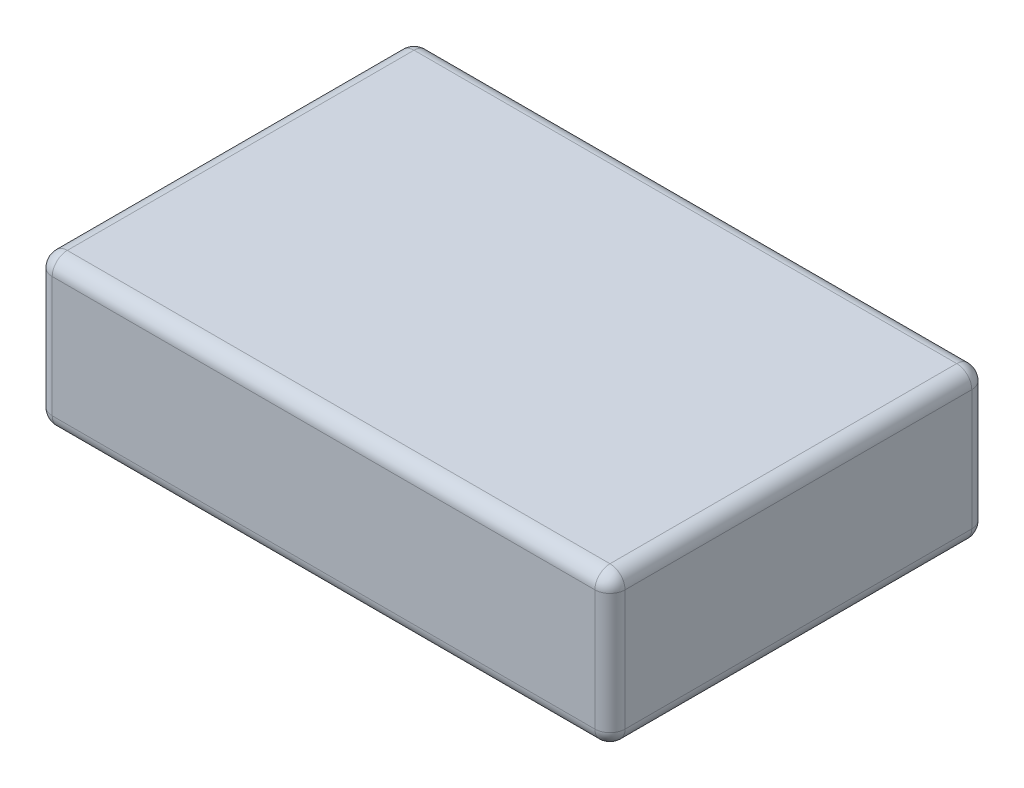
ISO-10303-21;
HEADER;
FILE_DESCRIPTION(('STEP AP214'),'2;1');
FILE_NAME('part.step','',(''),(''),'','','');
FILE_SCHEMA(('AUTOMOTIVE_DESIGN { 1 0 10303 214 1 1 1 1 }'));
ENDSEC;
DATA;
#1=APPLICATION_CONTEXT('core data for automotive mechanical design processes');
#2=APPLICATION_PROTOCOL_DEFINITION('international standard','automotive_design',2000,#1);
#3=PRODUCT_CONTEXT('',#1,'mechanical');
#4=PRODUCT('Part','Part','',(#3));
#5=PRODUCT_RELATED_PRODUCT_CATEGORY('part','',(#4));
#6=PRODUCT_DEFINITION_FORMATION('','',#4);
#7=PRODUCT_DEFINITION_CONTEXT('part definition',#1,'design');
#8=PRODUCT_DEFINITION('design','',#6,#7);
#9=PRODUCT_DEFINITION_SHAPE('','',#8);
#10=(LENGTH_UNIT() NAMED_UNIT(*) SI_UNIT(.MILLI.,.METRE.));
#11=(NAMED_UNIT(*) PLANE_ANGLE_UNIT() SI_UNIT($,.RADIAN.));
#12=(NAMED_UNIT(*) SI_UNIT($,.STERADIAN.) SOLID_ANGLE_UNIT());
#13=UNCERTAINTY_MEASURE_WITH_UNIT(LENGTH_MEASURE(1.E-05),#10,'distance_accuracy_value','');
#14=(GEOMETRIC_REPRESENTATION_CONTEXT(3) GLOBAL_UNCERTAINTY_ASSIGNED_CONTEXT((#13)) GLOBAL_UNIT_ASSIGNED_CONTEXT((#10,
#11,#12)) REPRESENTATION_CONTEXT('',''));
#15=CARTESIAN_POINT('',(0.,0.,0.));
#16=DIRECTION('',(0.,0.,1.));
#17=DIRECTION('',(1.,0.,0.));
#18=AXIS2_PLACEMENT_3D('',#15,#16,#17);
#19=CARTESIAN_POINT('',(0.,20.,0.));
#20=DIRECTION('',(1.,0.,0.));
#21=DIRECTION('',(0.,0.,-1.));
#22=AXIS2_PLACEMENT_3D('',#19,#20,#21);
#23=PLANE('',#22);
#24=DIRECTION('',(0.,0.,1.));
#25=VECTOR('',#24,1.);
#26=CARTESIAN_POINT('',(0.,18.,0.));
#27=LINE('',#26,#25);
#28=CARTESIAN_POINT('',(0.,18.,48.));
#29=VERTEX_POINT('',#28);
#30=CARTESIAN_POINT('',(0.,18.,2.));
#31=VERTEX_POINT('',#30);
#32=EDGE_CURVE('E137',#29,#31,#27,.F.);
#33=ORIENTED_EDGE('',*,*,#32,.T.);
#34=DIRECTION('',(0.,-1.,0.));
#35=VECTOR('',#34,1.);
#36=CARTESIAN_POINT('',(0.,20.,2.));
#37=LINE('',#36,#35);
#38=CARTESIAN_POINT('',(0.,2.,2.));
#39=VERTEX_POINT('',#38);
#40=EDGE_CURVE('E174',#31,#39,#37,.T.);
#41=ORIENTED_EDGE('',*,*,#40,.T.);
#42=DIRECTION('',(0.,0.,1.));
#43=VECTOR('',#42,1.);
#44=CARTESIAN_POINT('',(0.,2.,0.));
#45=LINE('',#44,#43);
#46=CARTESIAN_POINT('',(0.,2.,48.));
#47=VERTEX_POINT('',#46);
#48=EDGE_CURVE('E140',#39,#47,#45,.T.);
#49=ORIENTED_EDGE('',*,*,#48,.T.);
#50=DIRECTION('',(0.,-1.,0.));
#51=VECTOR('',#50,1.);
#52=CARTESIAN_POINT('',(0.,20.,48.));
#53=LINE('',#52,#51);
#54=EDGE_CURVE('E133',#47,#29,#53,.F.);
#55=ORIENTED_EDGE('',*,*,#54,.T.);
#56=EDGE_LOOP('',(#33,#41,#49,#55));
#57=FACE_BOUND('',#56,.T.);
#58=ADVANCED_FACE('F45',(#57),#23,.F.);
#59=CARTESIAN_POINT('',(0.,20.,50.));
#60=DIRECTION('',(0.,0.,-1.));
#61=DIRECTION('',(-1.,0.,0.));
#62=AXIS2_PLACEMENT_3D('',#59,#60,#61);
#63=PLANE('',#62);
#64=DIRECTION('',(0.,-1.,0.));
#65=VECTOR('',#64,1.);
#66=CARTESIAN_POINT('',(2.,20.,50.));
#67=LINE('',#66,#65);
#68=CARTESIAN_POINT('',(2.,18.,50.));
#69=VERTEX_POINT('',#68);
#70=CARTESIAN_POINT('',(2.,2.,50.));
#71=VERTEX_POINT('',#70);
#72=EDGE_CURVE('E151',#69,#71,#67,.T.);
#73=ORIENTED_EDGE('',*,*,#72,.T.);
#74=DIRECTION('',(1.,0.,0.));
#75=VECTOR('',#74,1.);
#76=CARTESIAN_POINT('',(0.,2.,50.));
#77=LINE('',#76,#75);
#78=CARTESIAN_POINT('',(74.,2.,50.));
#79=VERTEX_POINT('',#78);
#80=EDGE_CURVE('E208',#71,#79,#77,.T.);
#81=ORIENTED_EDGE('',*,*,#80,.T.);
#82=DIRECTION('',(0.,-1.,0.));
#83=VECTOR('',#82,1.);
#84=CARTESIAN_POINT('',(74.,20.,50.));
#85=LINE('',#84,#83);
#86=CARTESIAN_POINT('',(74.,18.,50.));
#87=VERTEX_POINT('',#86);
#88=EDGE_CURVE('E205',#79,#87,#85,.F.);
#89=ORIENTED_EDGE('',*,*,#88,.T.);
#90=DIRECTION('',(1.,0.,0.));
#91=VECTOR('',#90,1.);
#92=CARTESIAN_POINT('',(0.,18.,50.));
#93=LINE('',#92,#91);
#94=EDGE_CURVE('E203',#87,#69,#93,.F.);
#95=ORIENTED_EDGE('',*,*,#94,.T.);
#96=EDGE_LOOP('',(#73,#81,#89,#95));
#97=FACE_BOUND('',#96,.T.);
#98=ADVANCED_FACE('F306',(#97),#63,.F.);
#99=CARTESIAN_POINT('',(76.,20.,0.));
#100=DIRECTION('',(-1.,0.,0.));
#101=DIRECTION('',(0.,0.,1.));
#102=AXIS2_PLACEMENT_3D('',#99,#100,#101);
#103=PLANE('',#102);
#104=DIRECTION('',(0.,0.,-1.));
#105=VECTOR('',#104,1.);
#106=CARTESIAN_POINT('',(76.,2.,0.));
#107=LINE('',#106,#105);
#108=CARTESIAN_POINT('',(76.,2.,48.));
#109=VERTEX_POINT('',#108);
#110=CARTESIAN_POINT('',(76.,2.,2.));
#111=VERTEX_POINT('',#110);
#112=EDGE_CURVE('E198',#109,#111,#107,.T.);
#113=ORIENTED_EDGE('',*,*,#112,.T.);
#114=DIRECTION('',(0.,-1.,0.));
#115=VECTOR('',#114,1.);
#116=CARTESIAN_POINT('',(76.,20.,2.));
#117=LINE('',#116,#115);
#118=CARTESIAN_POINT('',(76.,18.,2.));
#119=VERTEX_POINT('',#118);
#120=EDGE_CURVE('E200',#111,#119,#117,.F.);
#121=ORIENTED_EDGE('',*,*,#120,.T.);
#122=DIRECTION('',(0.,0.,-1.));
#123=VECTOR('',#122,1.);
#124=CARTESIAN_POINT('',(76.,18.,50.));
#125=LINE('',#124,#123);
#126=CARTESIAN_POINT('',(76.,18.,48.));
#127=VERTEX_POINT('',#126);
#128=EDGE_CURVE('E194',#119,#127,#125,.F.);
#129=ORIENTED_EDGE('',*,*,#128,.T.);
#130=DIRECTION('',(0.,-1.,0.));
#131=VECTOR('',#130,1.);
#132=CARTESIAN_POINT('',(76.,20.,48.));
#133=LINE('',#132,#131);
#134=EDGE_CURVE('E196',#127,#109,#133,.T.);
#135=ORIENTED_EDGE('',*,*,#134,.T.);
#136=EDGE_LOOP('',(#113,#121,#129,#135));
#137=FACE_BOUND('',#136,.T.);
#138=ADVANCED_FACE('F285',(#137),#103,.F.);
#139=CARTESIAN_POINT('',(0.,20.,0.));
#140=DIRECTION('',(0.,0.,1.));
#141=DIRECTION('',(1.,0.,0.));
#142=AXIS2_PLACEMENT_3D('',#139,#140,#141);
#143=PLANE('',#142);
#144=DIRECTION('',(-1.,0.,0.));
#145=VECTOR('',#144,1.);
#146=CARTESIAN_POINT('',(0.,2.,0.));
#147=LINE('',#146,#145);
#148=CARTESIAN_POINT('',(74.,2.,0.));
#149=VERTEX_POINT('',#148);
#150=CARTESIAN_POINT('',(2.,2.,0.));
#151=VERTEX_POINT('',#150);
#152=EDGE_CURVE('E180',#149,#151,#147,.T.);
#153=ORIENTED_EDGE('',*,*,#152,.T.);
#154=DIRECTION('',(0.,-1.,0.));
#155=VECTOR('',#154,1.);
#156=CARTESIAN_POINT('',(2.,20.,0.));
#157=LINE('',#156,#155);
#158=CARTESIAN_POINT('',(2.,18.,0.));
#159=VERTEX_POINT('',#158);
#160=EDGE_CURVE('E182',#151,#159,#157,.F.);
#161=ORIENTED_EDGE('',*,*,#160,.T.);
#162=DIRECTION('',(-1.,0.,0.));
#163=VECTOR('',#162,1.);
#164=CARTESIAN_POINT('',(76.,18.,0.));
#165=LINE('',#164,#163);
#166=CARTESIAN_POINT('',(74.,18.,0.));
#167=VERTEX_POINT('',#166);
#168=EDGE_CURVE('E176',#159,#167,#165,.F.);
#169=ORIENTED_EDGE('',*,*,#168,.T.);
#170=DIRECTION('',(0.,-1.,0.));
#171=VECTOR('',#170,1.);
#172=CARTESIAN_POINT('',(74.,20.,0.));
#173=LINE('',#172,#171);
#174=EDGE_CURVE('E178',#167,#149,#173,.T.);
#175=ORIENTED_EDGE('',*,*,#174,.T.);
#176=EDGE_LOOP('',(#153,#161,#169,#175));
#177=FACE_BOUND('',#176,.T.);
#178=ADVANCED_FACE('F313',(#177),#143,.F.);
#179=CARTESIAN_POINT('',(0.,20.,0.));
#180=DIRECTION('',(0.,1.,0.));
#181=DIRECTION('',(0.,0.,1.));
#182=AXIS2_PLACEMENT_3D('',#179,#180,#181);
#183=PLANE('',#182);
#184=DIRECTION('',(0.,0.,-1.));
#185=VECTOR('',#184,1.);
#186=CARTESIAN_POINT('',(74.,20.,0.));
#187=LINE('',#186,#185);
#188=CARTESIAN_POINT('',(74.,20.,48.));
#189=VERTEX_POINT('',#188);
#190=CARTESIAN_POINT('',(74.,20.,2.));
#191=VERTEX_POINT('',#190);
#192=EDGE_CURVE('E54',#189,#191,#187,.T.);
#193=ORIENTED_EDGE('',*,*,#192,.T.);
#194=DIRECTION('',(-1.,0.,0.));
#195=VECTOR('',#194,1.);
#196=CARTESIAN_POINT('',(0.,20.,2.));
#197=LINE('',#196,#195);
#198=CARTESIAN_POINT('',(2.,20.,2.));
#199=VERTEX_POINT('',#198);
#200=EDGE_CURVE('E11',#191,#199,#197,.T.);
#201=ORIENTED_EDGE('',*,*,#200,.T.);
#202=DIRECTION('',(0.,0.,1.));
#203=VECTOR('',#202,1.);
#204=CARTESIAN_POINT('',(2.,20.,50.));
#205=LINE('',#204,#203);
#206=CARTESIAN_POINT('',(2.,20.,48.));
#207=VERTEX_POINT('',#206);
#208=EDGE_CURVE('E210',#199,#207,#205,.T.);
#209=ORIENTED_EDGE('',*,*,#208,.T.);
#210=DIRECTION('',(1.,0.,0.));
#211=VECTOR('',#210,1.);
#212=CARTESIAN_POINT('',(76.,20.,48.));
#213=LINE('',#212,#211);
#214=EDGE_CURVE('E65',#207,#189,#213,.T.);
#215=ORIENTED_EDGE('',*,*,#214,.T.);
#216=EDGE_LOOP('',(#193,#201,#209,#215));
#217=FACE_BOUND('',#216,.T.);
#218=ADVANCED_FACE('F378',(#217),#183,.T.);
#219=CARTESIAN_POINT('',(0.,0.,0.));
#220=DIRECTION('',(0.,1.,0.));
#221=DIRECTION('',(0.,0.,1.));
#222=AXIS2_PLACEMENT_3D('',#219,#220,#221);
#223=PLANE('',#222);
#224=DIRECTION('',(0.,0.,1.));
#225=VECTOR('',#224,1.);
#226=CARTESIAN_POINT('',(2.,0.,0.));
#227=LINE('',#226,#225);
#228=CARTESIAN_POINT('',(2.,0.,48.));
#229=VERTEX_POINT('',#228);
#230=CARTESIAN_POINT('',(2.,0.,2.));
#231=VERTEX_POINT('',#230);
#232=EDGE_CURVE('E189',#229,#231,#227,.F.);
#233=ORIENTED_EDGE('',*,*,#232,.T.);
#234=DIRECTION('',(-1.,0.,0.));
#235=VECTOR('',#234,1.);
#236=CARTESIAN_POINT('',(0.,0.,2.));
#237=LINE('',#236,#235);
#238=CARTESIAN_POINT('',(74.,0.,2.));
#239=VERTEX_POINT('',#238);
#240=EDGE_CURVE('E191',#231,#239,#237,.F.);
#241=ORIENTED_EDGE('',*,*,#240,.T.);
#242=DIRECTION('',(0.,0.,-1.));
#243=VECTOR('',#242,1.);
#244=CARTESIAN_POINT('',(74.,0.,0.));
#245=LINE('',#244,#243);
#246=CARTESIAN_POINT('',(74.,0.,48.));
#247=VERTEX_POINT('',#246);
#248=EDGE_CURVE('E187',#239,#247,#245,.F.);
#249=ORIENTED_EDGE('',*,*,#248,.T.);
#250=DIRECTION('',(1.,0.,0.));
#251=VECTOR('',#250,1.);
#252=CARTESIAN_POINT('',(0.,0.,48.));
#253=LINE('',#252,#251);
#254=EDGE_CURVE('E185',#247,#229,#253,.F.);
#255=ORIENTED_EDGE('',*,*,#254,.T.);
#256=EDGE_LOOP('',(#233,#241,#249,#255));
#257=FACE_BOUND('',#256,.T.);
#258=ADVANCED_FACE('F276',(#257),#223,.F.);
#259=CARTESIAN_POINT('',(74.,20.,48.));
#260=DIRECTION('',(0.,-1.,0.));
#261=DIRECTION('',(0.,0.,-1.));
#262=AXIS2_PLACEMENT_3D('',#259,#260,#261);
#263=CYLINDRICAL_SURFACE('',#262,2.);
#264=CARTESIAN_POINT('',(74.,18.,48.));
#265=DIRECTION('',(0.,1.,0.));
#266=DIRECTION('',(0.,0.,1.));
#267=AXIS2_PLACEMENT_3D('',#264,#265,#266);
#268=CIRCLE('',#267,2.);
#269=EDGE_CURVE('E49',#87,#127,#268,.T.);
#270=ORIENTED_EDGE('',*,*,#269,.F.);
#271=ORIENTED_EDGE('',*,*,#88,.F.);
#272=CARTESIAN_POINT('',(74.,2.,48.));
#273=DIRECTION('',(0.,-1.,0.));
#274=DIRECTION('',(0.,0.,-1.));
#275=AXIS2_PLACEMENT_3D('',#272,#273,#274);
#276=CIRCLE('',#275,2.);
#277=EDGE_CURVE('E171',#109,#79,#276,.T.);
#278=ORIENTED_EDGE('',*,*,#277,.F.);
#279=ORIENTED_EDGE('',*,*,#134,.F.);
#280=EDGE_LOOP('',(#270,#271,#278,#279));
#281=FACE_BOUND('',#280,.T.);
#282=ADVANCED_FACE('F47',(#281),#263,.T.);
#283=CARTESIAN_POINT('',(74.,18.,48.));
#284=DIRECTION('',(1.,0.,0.));
#285=DIRECTION('',(0.,0.,-1.));
#286=AXIS2_PLACEMENT_3D('',#283,#284,#285);
#287=SPHERICAL_SURFACE('',#286,2.);
#288=CARTESIAN_POINT('',(74.,18.,48.));
#289=DIRECTION('',(1.,0.,0.));
#290=DIRECTION('',(0.,0.,-1.));
#291=AXIS2_PLACEMENT_3D('',#288,#289,#290);
#292=CIRCLE('',#291,2.);
#293=EDGE_CURVE('E255',#87,#189,#292,.F.);
#294=ORIENTED_EDGE('',*,*,#293,.F.);
#295=ORIENTED_EDGE('',*,*,#269,.T.);
#296=CARTESIAN_POINT('',(74.,18.,48.));
#297=DIRECTION('',(0.,0.,1.));
#298=DIRECTION('',(1.,0.,0.));
#299=AXIS2_PLACEMENT_3D('',#296,#297,#298);
#300=CIRCLE('',#299,2.);
#301=EDGE_CURVE('E257',#189,#127,#300,.F.);
#302=ORIENTED_EDGE('',*,*,#301,.F.);
#303=EDGE_LOOP('',(#294,#295,#302));
#304=FACE_BOUND('',#303,.T.);
#305=ADVANCED_FACE('F301',(#304),#287,.T.);
#306=CARTESIAN_POINT('',(74.,2.,48.));
#307=DIRECTION('',(0.,0.,1.));
#308=DIRECTION('',(0.,-1.,0.));
#309=AXIS2_PLACEMENT_3D('',#306,#307,#308);
#310=SPHERICAL_SURFACE('',#309,2.);
#311=CARTESIAN_POINT('',(74.,2.,48.));
#312=DIRECTION('',(0.,0.,1.));
#313=DIRECTION('',(1.,0.,0.));
#314=AXIS2_PLACEMENT_3D('',#311,#312,#313);
#315=CIRCLE('',#314,2.);
#316=EDGE_CURVE('E249',#109,#247,#315,.F.);
#317=ORIENTED_EDGE('',*,*,#316,.F.);
#318=ORIENTED_EDGE('',*,*,#277,.T.);
#319=CARTESIAN_POINT('',(74.,2.,48.));
#320=DIRECTION('',(1.,0.,0.));
#321=DIRECTION('',(0.,0.,-1.));
#322=AXIS2_PLACEMENT_3D('',#319,#320,#321);
#323=CIRCLE('',#322,2.);
#324=EDGE_CURVE('E252',#247,#79,#323,.F.);
#325=ORIENTED_EDGE('',*,*,#324,.F.);
#326=EDGE_LOOP('',(#317,#318,#325));
#327=FACE_BOUND('',#326,.T.);
#328=ADVANCED_FACE('F264',(#327),#310,.T.);
#329=CARTESIAN_POINT('',(74.,18.,0.));
#330=DIRECTION('',(0.,0.,1.));
#331=DIRECTION('',(1.,0.,0.));
#332=AXIS2_PLACEMENT_3D('',#329,#330,#331);
#333=CYLINDRICAL_SURFACE('',#332,2.);
#334=ORIENTED_EDGE('',*,*,#301,.T.);
#335=ORIENTED_EDGE('',*,*,#128,.F.);
#336=CARTESIAN_POINT('',(74.,18.,2.));
#337=DIRECTION('',(0.,0.,-1.));
#338=DIRECTION('',(-1.,0.,0.));
#339=AXIS2_PLACEMENT_3D('',#336,#337,#338);
#340=CIRCLE('',#339,2.);
#341=EDGE_CURVE('E244',#191,#119,#340,.T.);
#342=ORIENTED_EDGE('',*,*,#341,.F.);
#343=ORIENTED_EDGE('',*,*,#192,.F.);
#344=EDGE_LOOP('',(#334,#335,#342,#343));
#345=FACE_BOUND('',#344,.T.);
#346=ADVANCED_FACE('F296',(#345),#333,.T.);
#347=CARTESIAN_POINT('',(0.,18.,48.));
#348=DIRECTION('',(-1.,0.,0.));
#349=DIRECTION('',(0.,0.,1.));
#350=AXIS2_PLACEMENT_3D('',#347,#348,#349);
#351=CYLINDRICAL_SURFACE('',#350,2.);
#352=ORIENTED_EDGE('',*,*,#293,.T.);
#353=ORIENTED_EDGE('',*,*,#214,.F.);
#354=CARTESIAN_POINT('',(2.,18.,48.));
#355=DIRECTION('',(-1.,0.,0.));
#356=DIRECTION('',(0.,0.,1.));
#357=AXIS2_PLACEMENT_3D('',#354,#355,#356);
#358=CIRCLE('',#357,2.);
#359=EDGE_CURVE('E155',#69,#207,#358,.T.);
#360=ORIENTED_EDGE('',*,*,#359,.F.);
#361=ORIENTED_EDGE('',*,*,#94,.F.);
#362=EDGE_LOOP('',(#352,#353,#360,#361));
#363=FACE_BOUND('',#362,.T.);
#364=ADVANCED_FACE('F304',(#363),#351,.T.);
#365=CARTESIAN_POINT('',(2.,20.,48.));
#366=DIRECTION('',(0.,-1.,0.));
#367=DIRECTION('',(0.,0.,-1.));
#368=AXIS2_PLACEMENT_3D('',#365,#366,#367);
#369=CYLINDRICAL_SURFACE('',#368,2.);
#370=CARTESIAN_POINT('',(2.,2.,48.));
#371=DIRECTION('',(0.,-1.,0.));
#372=DIRECTION('',(0.,0.,-1.));
#373=AXIS2_PLACEMENT_3D('',#370,#371,#372);
#374=CIRCLE('',#373,2.);
#375=EDGE_CURVE('E156',#71,#47,#374,.T.);
#376=ORIENTED_EDGE('',*,*,#375,.F.);
#377=ORIENTED_EDGE('',*,*,#72,.F.);
#378=CARTESIAN_POINT('',(2.,18.,48.));
#379=DIRECTION('',(0.,1.,0.));
#380=DIRECTION('',(0.,0.,1.));
#381=AXIS2_PLACEMENT_3D('',#378,#379,#380);
#382=CIRCLE('',#381,2.);
#383=EDGE_CURVE('E147',#29,#69,#382,.T.);
#384=ORIENTED_EDGE('',*,*,#383,.F.);
#385=ORIENTED_EDGE('',*,*,#54,.F.);
#386=EDGE_LOOP('',(#376,#377,#384,#385));
#387=FACE_BOUND('',#386,.T.);
#388=ADVANCED_FACE('F149',(#387),#369,.T.);
#389=CARTESIAN_POINT('',(0.,2.,48.));
#390=DIRECTION('',(1.,0.,0.));
#391=DIRECTION('',(0.,0.,-1.));
#392=AXIS2_PLACEMENT_3D('',#389,#390,#391);
#393=CYLINDRICAL_SURFACE('',#392,2.);
#394=ORIENTED_EDGE('',*,*,#324,.T.);
#395=ORIENTED_EDGE('',*,*,#80,.F.);
#396=CARTESIAN_POINT('',(2.,2.,48.));
#397=DIRECTION('',(-1.,0.,0.));
#398=DIRECTION('',(0.,0.,1.));
#399=AXIS2_PLACEMENT_3D('',#396,#397,#398);
#400=CIRCLE('',#399,2.);
#401=EDGE_CURVE('E240',#229,#71,#400,.T.);
#402=ORIENTED_EDGE('',*,*,#401,.F.);
#403=ORIENTED_EDGE('',*,*,#254,.F.);
#404=EDGE_LOOP('',(#394,#395,#402,#403));
#405=FACE_BOUND('',#404,.T.);
#406=ADVANCED_FACE('F272',(#405),#393,.T.);
#407=CARTESIAN_POINT('',(74.,2.,0.));
#408=DIRECTION('',(0.,0.,-1.));
#409=DIRECTION('',(-1.,0.,0.));
#410=AXIS2_PLACEMENT_3D('',#407,#408,#409);
#411=CYLINDRICAL_SURFACE('',#410,2.);
#412=ORIENTED_EDGE('',*,*,#316,.T.);
#413=ORIENTED_EDGE('',*,*,#248,.F.);
#414=CARTESIAN_POINT('',(74.,2.,2.));
#415=DIRECTION('',(0.,0.,-1.));
#416=DIRECTION('',(-1.,0.,0.));
#417=AXIS2_PLACEMENT_3D('',#414,#415,#416);
#418=CIRCLE('',#417,2.);
#419=EDGE_CURVE('E237',#111,#239,#418,.T.);
#420=ORIENTED_EDGE('',*,*,#419,.F.);
#421=ORIENTED_EDGE('',*,*,#112,.F.);
#422=EDGE_LOOP('',(#412,#413,#420,#421));
#423=FACE_BOUND('',#422,.T.);
#424=ADVANCED_FACE('F282',(#423),#411,.T.);
#425=CARTESIAN_POINT('',(74.,20.,2.));
#426=DIRECTION('',(0.,-1.,0.));
#427=DIRECTION('',(0.,0.,-1.));
#428=AXIS2_PLACEMENT_3D('',#425,#426,#427);
#429=CYLINDRICAL_SURFACE('',#428,2.);
#430=CARTESIAN_POINT('',(74.,18.,2.));
#431=DIRECTION('',(0.,1.,0.));
#432=DIRECTION('',(0.,0.,1.));
#433=AXIS2_PLACEMENT_3D('',#430,#431,#432);
#434=CIRCLE('',#433,2.);
#435=EDGE_CURVE('E246',#119,#167,#434,.T.);
#436=ORIENTED_EDGE('',*,*,#435,.F.);
#437=ORIENTED_EDGE('',*,*,#120,.F.);
#438=CARTESIAN_POINT('',(74.,2.,2.));
#439=DIRECTION('',(0.,-1.,0.));
#440=DIRECTION('',(0.,0.,-1.));
#441=AXIS2_PLACEMENT_3D('',#438,#439,#440);
#442=CIRCLE('',#441,2.);
#443=EDGE_CURVE('E234',#149,#111,#442,.T.);
#444=ORIENTED_EDGE('',*,*,#443,.F.);
#445=ORIENTED_EDGE('',*,*,#174,.F.);
#446=EDGE_LOOP('',(#436,#437,#444,#445));
#447=FACE_BOUND('',#446,.T.);
#448=ADVANCED_FACE('F289',(#447),#429,.T.);
#449=CARTESIAN_POINT('',(74.,18.,2.));
#450=DIRECTION('',(1.,0.,0.));
#451=DIRECTION('',(0.,0.,-1.));
#452=AXIS2_PLACEMENT_3D('',#449,#450,#451);
#453=SPHERICAL_SURFACE('',#452,2.);
#454=ORIENTED_EDGE('',*,*,#341,.T.);
#455=ORIENTED_EDGE('',*,*,#435,.T.);
#456=CARTESIAN_POINT('',(74.,18.,2.));
#457=DIRECTION('',(1.,0.,0.));
#458=DIRECTION('',(0.,0.,-1.));
#459=AXIS2_PLACEMENT_3D('',#456,#457,#458);
#460=CIRCLE('',#459,2.);
#461=EDGE_CURVE('E163',#191,#167,#460,.F.);
#462=ORIENTED_EDGE('',*,*,#461,.F.);
#463=EDGE_LOOP('',(#454,#455,#462));
#464=FACE_BOUND('',#463,.T.);
#465=ADVANCED_FACE('F354',(#464),#453,.T.);
#466=CARTESIAN_POINT('',(2.,18.,48.));
#467=DIRECTION('',(0.,0.,1.));
#468=DIRECTION('',(1.,0.,0.));
#469=AXIS2_PLACEMENT_3D('',#466,#467,#468);
#470=SPHERICAL_SURFACE('',#469,2.);
#471=ORIENTED_EDGE('',*,*,#383,.T.);
#472=ORIENTED_EDGE('',*,*,#359,.T.);
#473=CARTESIAN_POINT('',(2.,18.,48.));
#474=DIRECTION('',(0.,0.,1.));
#475=DIRECTION('',(1.,0.,0.));
#476=AXIS2_PLACEMENT_3D('',#473,#474,#475);
#477=CIRCLE('',#476,2.);
#478=EDGE_CURVE('E159',#29,#207,#477,.F.);
#479=ORIENTED_EDGE('',*,*,#478,.F.);
#480=EDGE_LOOP('',(#471,#472,#479));
#481=FACE_BOUND('',#480,.T.);
#482=ADVANCED_FACE('F160',(#481),#470,.T.);
#483=CARTESIAN_POINT('',(2.,2.,48.));
#484=DIRECTION('',(0.,0.,1.));
#485=DIRECTION('',(0.,-1.,0.));
#486=AXIS2_PLACEMENT_3D('',#483,#484,#485);
#487=SPHERICAL_SURFACE('',#486,2.);
#488=ORIENTED_EDGE('',*,*,#401,.T.);
#489=ORIENTED_EDGE('',*,*,#375,.T.);
#490=CARTESIAN_POINT('',(2.,2.,48.));
#491=DIRECTION('',(0.,0.,1.));
#492=DIRECTION('',(1.,0.,0.));
#493=AXIS2_PLACEMENT_3D('',#490,#491,#492);
#494=CIRCLE('',#493,2.);
#495=EDGE_CURVE('E164',#229,#47,#494,.F.);
#496=ORIENTED_EDGE('',*,*,#495,.F.);
#497=EDGE_LOOP('',(#488,#489,#496));
#498=FACE_BOUND('',#497,.T.);
#499=ADVANCED_FACE('F347',(#498),#487,.T.);
#500=CARTESIAN_POINT('',(74.,2.,2.));
#501=DIRECTION('',(1.,0.,0.));
#502=DIRECTION('',(0.,1.,0.));
#503=AXIS2_PLACEMENT_3D('',#500,#501,#502);
#504=SPHERICAL_SURFACE('',#503,2.);
#505=ORIENTED_EDGE('',*,*,#443,.T.);
#506=ORIENTED_EDGE('',*,*,#419,.T.);
#507=CARTESIAN_POINT('',(74.,2.,2.));
#508=DIRECTION('',(1.,0.,0.));
#509=DIRECTION('',(0.,0.,-1.));
#510=AXIS2_PLACEMENT_3D('',#507,#508,#509);
#511=CIRCLE('',#510,2.);
#512=EDGE_CURVE('E228',#149,#239,#511,.F.);
#513=ORIENTED_EDGE('',*,*,#512,.F.);
#514=EDGE_LOOP('',(#505,#506,#513));
#515=FACE_BOUND('',#514,.T.);
#516=ADVANCED_FACE('F343',(#515),#504,.T.);
#517=CARTESIAN_POINT('',(0.,18.,2.));
#518=DIRECTION('',(1.,0.,0.));
#519=DIRECTION('',(0.,0.,-1.));
#520=AXIS2_PLACEMENT_3D('',#517,#518,#519);
#521=CYLINDRICAL_SURFACE('',#520,2.);
#522=ORIENTED_EDGE('',*,*,#461,.T.);
#523=ORIENTED_EDGE('',*,*,#168,.F.);
#524=CARTESIAN_POINT('',(2.,18.,2.));
#525=DIRECTION('',(-1.,0.,0.));
#526=DIRECTION('',(0.,0.,1.));
#527=AXIS2_PLACEMENT_3D('',#524,#525,#526);
#528=CIRCLE('',#527,2.);
#529=EDGE_CURVE('E225',#199,#159,#528,.T.);
#530=ORIENTED_EDGE('',*,*,#529,.F.);
#531=ORIENTED_EDGE('',*,*,#200,.F.);
#532=EDGE_LOOP('',(#522,#523,#530,#531));
#533=FACE_BOUND('',#532,.T.);
#534=ADVANCED_FACE('F340',(#533),#521,.T.);
#535=CARTESIAN_POINT('',(2.,18.,0.));
#536=DIRECTION('',(0.,0.,-1.));
#537=DIRECTION('',(-1.,0.,0.));
#538=AXIS2_PLACEMENT_3D('',#535,#536,#537);
#539=CYLINDRICAL_SURFACE('',#538,2.);
#540=ORIENTED_EDGE('',*,*,#478,.T.);
#541=ORIENTED_EDGE('',*,*,#208,.F.);
#542=CARTESIAN_POINT('',(2.,18.,2.));
#543=DIRECTION('',(0.,0.,-1.));
#544=DIRECTION('',(-1.,0.,0.));
#545=AXIS2_PLACEMENT_3D('',#542,#543,#544);
#546=CIRCLE('',#545,2.);
#547=EDGE_CURVE('E167',#31,#199,#546,.T.);
#548=ORIENTED_EDGE('',*,*,#547,.F.);
#549=ORIENTED_EDGE('',*,*,#32,.F.);
#550=EDGE_LOOP('',(#540,#541,#548,#549));
#551=FACE_BOUND('',#550,.T.);
#552=ADVANCED_FACE('F166',(#551),#539,.T.);
#553=CARTESIAN_POINT('',(2.,2.,0.));
#554=DIRECTION('',(0.,0.,1.));
#555=DIRECTION('',(1.,0.,0.));
#556=AXIS2_PLACEMENT_3D('',#553,#554,#555);
#557=CYLINDRICAL_SURFACE('',#556,2.);
#558=ORIENTED_EDGE('',*,*,#495,.T.);
#559=ORIENTED_EDGE('',*,*,#48,.F.);
#560=CARTESIAN_POINT('',(2.,2.,2.));
#561=DIRECTION('',(0.,0.,-1.));
#562=DIRECTION('',(-1.,0.,0.));
#563=AXIS2_PLACEMENT_3D('',#560,#561,#562);
#564=CIRCLE('',#563,2.);
#565=EDGE_CURVE('E221',#231,#39,#564,.T.);
#566=ORIENTED_EDGE('',*,*,#565,.F.);
#567=ORIENTED_EDGE('',*,*,#232,.F.);
#568=EDGE_LOOP('',(#558,#559,#566,#567));
#569=FACE_BOUND('',#568,.T.);
#570=ADVANCED_FACE('F333',(#569),#557,.T.);
#571=CARTESIAN_POINT('',(0.,2.,2.));
#572=DIRECTION('',(-1.,0.,0.));
#573=DIRECTION('',(0.,0.,1.));
#574=AXIS2_PLACEMENT_3D('',#571,#572,#573);
#575=CYLINDRICAL_SURFACE('',#574,2.);
#576=ORIENTED_EDGE('',*,*,#512,.T.);
#577=ORIENTED_EDGE('',*,*,#240,.F.);
#578=CARTESIAN_POINT('',(2.,2.,2.));
#579=DIRECTION('',(-1.,0.,0.));
#580=DIRECTION('',(0.,0.,1.));
#581=AXIS2_PLACEMENT_3D('',#578,#579,#580);
#582=CIRCLE('',#581,2.);
#583=EDGE_CURVE('E218',#151,#231,#582,.T.);
#584=ORIENTED_EDGE('',*,*,#583,.F.);
#585=ORIENTED_EDGE('',*,*,#152,.F.);
#586=EDGE_LOOP('',(#576,#577,#584,#585));
#587=FACE_BOUND('',#586,.T.);
#588=ADVANCED_FACE('F329',(#587),#575,.T.);
#589=CARTESIAN_POINT('',(2.,18.,2.));
#590=DIRECTION('',(0.,1.,0.));
#591=DIRECTION('',(0.,0.,1.));
#592=AXIS2_PLACEMENT_3D('',#589,#590,#591);
#593=SPHERICAL_SURFACE('',#592,2.);
#594=ORIENTED_EDGE('',*,*,#547,.T.);
#595=ORIENTED_EDGE('',*,*,#529,.T.);
#596=CARTESIAN_POINT('',(2.,18.,2.));
#597=DIRECTION('',(0.,1.,0.));
#598=DIRECTION('',(0.,0.,1.));
#599=AXIS2_PLACEMENT_3D('',#596,#597,#598);
#600=CIRCLE('',#599,2.);
#601=EDGE_CURVE('E216',#31,#159,#600,.F.);
#602=ORIENTED_EDGE('',*,*,#601,.F.);
#603=EDGE_LOOP('',(#594,#595,#602));
#604=FACE_BOUND('',#603,.T.);
#605=ADVANCED_FACE('F325',(#604),#593,.T.);
#606=CARTESIAN_POINT('',(2.,2.,2.));
#607=DIRECTION('',(0.,-1.,0.));
#608=DIRECTION('',(0.,0.,-1.));
#609=AXIS2_PLACEMENT_3D('',#606,#607,#608);
#610=SPHERICAL_SURFACE('',#609,2.);
#611=ORIENTED_EDGE('',*,*,#583,.T.);
#612=ORIENTED_EDGE('',*,*,#565,.T.);
#613=CARTESIAN_POINT('',(2.,2.,2.));
#614=DIRECTION('',(0.,-1.,0.));
#615=DIRECTION('',(0.,0.,-1.));
#616=AXIS2_PLACEMENT_3D('',#613,#614,#615);
#617=CIRCLE('',#616,2.);
#618=EDGE_CURVE('E214',#151,#39,#617,.F.);
#619=ORIENTED_EDGE('',*,*,#618,.F.);
#620=EDGE_LOOP('',(#611,#612,#619));
#621=FACE_BOUND('',#620,.T.);
#622=ADVANCED_FACE('F321',(#621),#610,.T.);
#623=CARTESIAN_POINT('',(2.,20.,2.));
#624=DIRECTION('',(0.,-1.,0.));
#625=DIRECTION('',(0.,0.,-1.));
#626=AXIS2_PLACEMENT_3D('',#623,#624,#625);
#627=CYLINDRICAL_SURFACE('',#626,2.);
#628=ORIENTED_EDGE('',*,*,#601,.T.);
#629=ORIENTED_EDGE('',*,*,#160,.F.);
#630=ORIENTED_EDGE('',*,*,#618,.T.);
#631=ORIENTED_EDGE('',*,*,#40,.F.);
#632=EDGE_LOOP('',(#628,#629,#630,#631));
#633=FACE_BOUND('',#632,.T.);
#634=ADVANCED_FACE('F318',(#633),#627,.T.);
#635=CLOSED_SHELL('',(#58,#98,#138,#178,#218,#258,#282,#305,#328,#346,#364,#388,#406,#424,#448,
#465,#482,#499,#516,#534,#552,#570,#588,#605,#622,#634));
#636=MANIFOLD_SOLID_BREP('B2',#635);
#637=ADVANCED_BREP_SHAPE_REPRESENTATION('',(#18,#636),#14);
#638=SHAPE_DEFINITION_REPRESENTATION(#9,#637);
ENDSEC;
END-ISO-10303-21;
